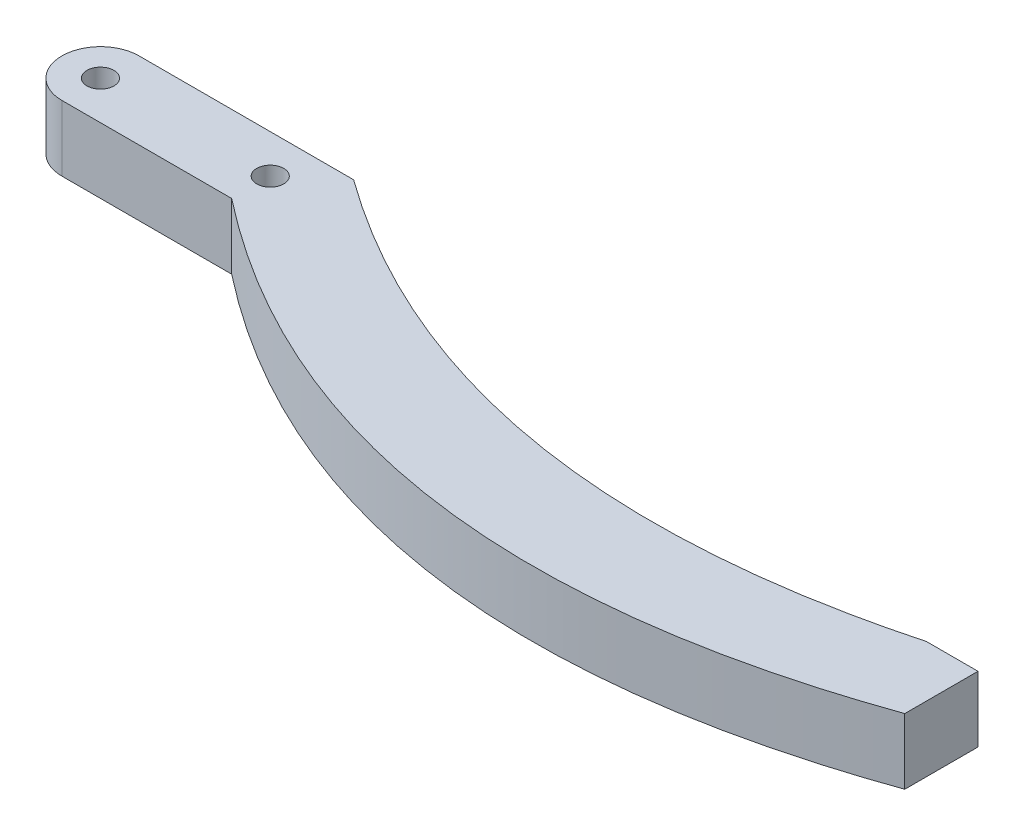
ISO-10303-21;
HEADER;
FILE_DESCRIPTION(('STEP AP214'),'2;1');
FILE_NAME('part.step','',(''),(''),'','','');
FILE_SCHEMA(('AUTOMOTIVE_DESIGN { 1 0 10303 214 1 1 1 1 }'));
ENDSEC;
DATA;
#1=APPLICATION_CONTEXT('core data for automotive mechanical design processes');
#2=APPLICATION_PROTOCOL_DEFINITION('international standard','automotive_design',2000,#1);
#3=PRODUCT_CONTEXT('',#1,'mechanical');
#4=PRODUCT('Part','Part','',(#3));
#5=PRODUCT_RELATED_PRODUCT_CATEGORY('part','',(#4));
#6=PRODUCT_DEFINITION_FORMATION('','',#4);
#7=PRODUCT_DEFINITION_CONTEXT('part definition',#1,'design');
#8=PRODUCT_DEFINITION('design','',#6,#7);
#9=PRODUCT_DEFINITION_SHAPE('','',#8);
#10=(LENGTH_UNIT() NAMED_UNIT(*) SI_UNIT(.MILLI.,.METRE.));
#11=(NAMED_UNIT(*) PLANE_ANGLE_UNIT() SI_UNIT($,.RADIAN.));
#12=(NAMED_UNIT(*) SI_UNIT($,.STERADIAN.) SOLID_ANGLE_UNIT());
#13=UNCERTAINTY_MEASURE_WITH_UNIT(LENGTH_MEASURE(1.E-05),#10,'distance_accuracy_value','');
#14=(GEOMETRIC_REPRESENTATION_CONTEXT(3) GLOBAL_UNCERTAINTY_ASSIGNED_CONTEXT((#13)) GLOBAL_UNIT_ASSIGNED_CONTEXT((#10,
#11,#12)) REPRESENTATION_CONTEXT('',''));
#15=CARTESIAN_POINT('',(0.,0.,0.));
#16=DIRECTION('',(0.,0.,1.));
#17=DIRECTION('',(1.,0.,0.));
#18=AXIS2_PLACEMENT_3D('',#15,#16,#17);
#19=CARTESIAN_POINT('',(0.,8.5,4.99999999999998));
#20=DIRECTION('',(0.,0.,1.));
#21=DIRECTION('',(1.,0.,0.));
#22=AXIS2_PLACEMENT_3D('',#19,#20,#21);
#23=PLANE('',#22);
#24=DIRECTION('',(-1.,0.,0.));
#25=VECTOR('',#24,1.);
#26=CARTESIAN_POINT('',(0.,0.,4.99999999999998));
#27=LINE('',#26,#25);
#28=CARTESIAN_POINT('',(0.,0.,4.99999999999998));
#29=VERTEX_POINT('',#28);
#30=CARTESIAN_POINT('',(-22.,0.,5.));
#31=VERTEX_POINT('',#30);
#32=EDGE_CURVE('E220',#29,#31,#27,.T.);
#33=ORIENTED_EDGE('',*,*,#32,.F.);
#34=DIRECTION('',(0.,-1.,0.));
#35=VECTOR('',#34,1.);
#36=CARTESIAN_POINT('',(0.,8.5,4.99999999999998));
#37=LINE('',#36,#35);
#38=CARTESIAN_POINT('',(0.,8.5,4.99999999999998));
#39=VERTEX_POINT('',#38);
#40=EDGE_CURVE('E11',#39,#29,#37,.T.);
#41=ORIENTED_EDGE('',*,*,#40,.F.);
#42=DIRECTION('',(-1.,0.,0.));
#43=VECTOR('',#42,1.);
#44=CARTESIAN_POINT('',(0.,8.5,4.99999999999998));
#45=LINE('',#44,#43);
#46=CARTESIAN_POINT('',(-22.,8.5,5.));
#47=VERTEX_POINT('',#46);
#48=EDGE_CURVE('E172',#39,#47,#45,.T.);
#49=ORIENTED_EDGE('',*,*,#48,.T.);
#50=DIRECTION('',(0.,-1.,0.));
#51=VECTOR('',#50,1.);
#52=CARTESIAN_POINT('',(-22.,8.5,5.));
#53=LINE('',#52,#51);
#54=EDGE_CURVE('E95',#47,#31,#53,.T.);
#55=ORIENTED_EDGE('',*,*,#54,.T.);
#56=EDGE_LOOP('',(#33,#41,#49,#55));
#57=FACE_BOUND('',#56,.T.);
#58=ADVANCED_FACE('F45',(#57),#23,.T.);
#59=CARTESIAN_POINT('',(0.,8.5,4.99999999999998));
#60=CARTESIAN_POINT('',(44.0607174625248,8.5,39.5752266662546));
#61=CARTESIAN_POINT('',(101.432631881709,8.5,19.199942722546));
#62=B_SPLINE_CURVE_WITH_KNOTS('',2,(#59,#60,#61),.UNSPECIFIED.,.F.,.F.,(3,3),(0.,1.),.UNSPECIFIED.);
#63=DIRECTION('',(0.,-1.,0.));
#64=VECTOR('',#63,1.);
#65=SURFACE_OF_LINEAR_EXTRUSION('',#62,#64);
#66=CARTESIAN_POINT('',(0.,0.,4.99999999999998));
#67=CARTESIAN_POINT('',(44.0607174625248,0.,39.5752266662546));
#68=CARTESIAN_POINT('',(101.432631881709,0.,19.199942722546));
#69=B_SPLINE_CURVE_WITH_KNOTS('',2,(#66,#67,#68),.UNSPECIFIED.,.F.,.F.,(3,3),(0.,1.),.UNSPECIFIED.);
#70=CARTESIAN_POINT('',(101.432631881709,0.,19.199942722546));
#71=VERTEX_POINT('',#70);
#72=EDGE_CURVE('E215',#29,#71,#69,.T.);
#73=ORIENTED_EDGE('',*,*,#72,.T.);
#74=DIRECTION('',(0.,-1.,0.));
#75=VECTOR('',#74,1.);
#76=CARTESIAN_POINT('',(101.432631881709,8.5,19.199942722546));
#77=LINE('',#76,#75);
#78=CARTESIAN_POINT('',(101.432631881709,8.5,19.199942722546));
#79=VERTEX_POINT('',#78);
#80=EDGE_CURVE('E55',#79,#71,#77,.T.);
#81=ORIENTED_EDGE('',*,*,#80,.F.);
#82=EDGE_CURVE('E166',#39,#79,#62,.T.);
#83=ORIENTED_EDGE('',*,*,#82,.F.);
#84=ORIENTED_EDGE('',*,*,#40,.T.);
#85=EDGE_LOOP('',(#73,#81,#83,#84));
#86=FACE_BOUND('',#85,.T.);
#87=ADVANCED_FACE('F160',(#86),#65,.F.);
#88=CARTESIAN_POINT('',(101.432631881709,8.5,0.));
#89=DIRECTION('',(1.,0.,0.));
#90=DIRECTION('',(0.,0.,-1.));
#91=AXIS2_PLACEMENT_3D('',#88,#89,#90);
#92=PLANE('',#91);
#93=DIRECTION('',(0.,0.,1.));
#94=VECTOR('',#93,1.);
#95=CARTESIAN_POINT('',(101.432631881709,0.,0.));
#96=LINE('',#95,#94);
#97=CARTESIAN_POINT('',(101.432631881709,0.,9.70672313107727));
#98=VERTEX_POINT('',#97);
#99=EDGE_CURVE('E211',#98,#71,#96,.T.);
#100=ORIENTED_EDGE('',*,*,#99,.F.);
#101=DIRECTION('',(0.,-1.,0.));
#102=VECTOR('',#101,1.);
#103=CARTESIAN_POINT('',(101.432631881709,8.5,9.70672313107727));
#104=LINE('',#103,#102);
#105=CARTESIAN_POINT('',(101.432631881709,8.5,9.70672313107727));
#106=VERTEX_POINT('',#105);
#107=EDGE_CURVE('E182',#106,#98,#104,.T.);
#108=ORIENTED_EDGE('',*,*,#107,.F.);
#109=DIRECTION('',(0.,0.,1.));
#110=VECTOR('',#109,1.);
#111=CARTESIAN_POINT('',(101.432631881709,8.5,0.));
#112=LINE('',#111,#110);
#113=EDGE_CURVE('E138',#106,#79,#112,.T.);
#114=ORIENTED_EDGE('',*,*,#113,.T.);
#115=ORIENTED_EDGE('',*,*,#80,.T.);
#116=EDGE_LOOP('',(#100,#108,#114,#115));
#117=FACE_BOUND('',#116,.T.);
#118=ADVANCED_FACE('F156',(#117),#92,.T.);
#119=CARTESIAN_POINT('',(0.,8.5,9.70672313107727));
#120=DIRECTION('',(0.,0.,-1.));
#121=DIRECTION('',(-1.,0.,0.));
#122=AXIS2_PLACEMENT_3D('',#119,#120,#121);
#123=PLANE('',#122);
#124=DIRECTION('',(1.,0.,0.));
#125=VECTOR('',#124,1.);
#126=CARTESIAN_POINT('',(0.,0.,9.70672313107727));
#127=LINE('',#126,#125);
#128=CARTESIAN_POINT('',(94.748347294238,0.,9.70672313107727));
#129=VERTEX_POINT('',#128);
#130=EDGE_CURVE('E185',#129,#98,#127,.T.);
#131=ORIENTED_EDGE('',*,*,#130,.F.);
#132=DIRECTION('',(0.,-1.,0.));
#133=VECTOR('',#132,1.);
#134=CARTESIAN_POINT('',(94.748347294238,8.5,9.70672313107727));
#135=LINE('',#134,#133);
#136=CARTESIAN_POINT('',(94.748347294238,8.5,9.70672313107727));
#137=VERTEX_POINT('',#136);
#138=EDGE_CURVE('E122',#137,#129,#135,.T.);
#139=ORIENTED_EDGE('',*,*,#138,.F.);
#140=DIRECTION('',(1.,0.,0.));
#141=VECTOR('',#140,1.);
#142=CARTESIAN_POINT('',(0.,8.5,9.70672313107727));
#143=LINE('',#142,#141);
#144=EDGE_CURVE('E134',#137,#106,#143,.T.);
#145=ORIENTED_EDGE('',*,*,#144,.T.);
#146=ORIENTED_EDGE('',*,*,#107,.T.);
#147=EDGE_LOOP('',(#131,#139,#145,#146));
#148=FACE_BOUND('',#147,.T.);
#149=ADVANCED_FACE('F152',(#148),#123,.T.);
#150=CARTESIAN_POINT('',(5.80901024848469,8.5,-5.00000000000002));
#151=CARTESIAN_POINT('',(44.7035915938563,8.5,23.1482274478453));
#152=CARTESIAN_POINT('',(94.748347294238,8.5,9.70672313107727));
#153=B_SPLINE_CURVE_WITH_KNOTS('',2,(#150,#151,#152),.UNSPECIFIED.,.F.,.F.,(3,3),(0.,1.),.UNSPECIFIED.);
#154=DIRECTION('',(0.,-1.,0.));
#155=VECTOR('',#154,1.);
#156=SURFACE_OF_LINEAR_EXTRUSION('',#153,#155);
#157=CARTESIAN_POINT('',(5.80901024848469,0.,-5.00000000000002));
#158=CARTESIAN_POINT('',(44.7035915938563,0.,23.1482274478453));
#159=CARTESIAN_POINT('',(94.748347294238,0.,9.70672313107727));
#160=B_SPLINE_CURVE_WITH_KNOTS('',2,(#157,#158,#159),.UNSPECIFIED.,.F.,.F.,(3,3),(0.,1.),.UNSPECIFIED.);
#161=CARTESIAN_POINT('',(5.80901024848469,0.,-5.00000000000002));
#162=VERTEX_POINT('',#161);
#163=EDGE_CURVE('E118',#162,#129,#160,.T.);
#164=ORIENTED_EDGE('',*,*,#163,.F.);
#165=DIRECTION('',(0.,-1.,0.));
#166=VECTOR('',#165,1.);
#167=CARTESIAN_POINT('',(5.80901024848469,8.5,-5.00000000000002));
#168=LINE('',#167,#166);
#169=CARTESIAN_POINT('',(5.80901024848469,8.5,-5.00000000000002));
#170=VERTEX_POINT('',#169);
#171=EDGE_CURVE('E112',#170,#162,#168,.T.);
#172=ORIENTED_EDGE('',*,*,#171,.F.);
#173=EDGE_CURVE('E116',#170,#137,#153,.T.);
#174=ORIENTED_EDGE('',*,*,#173,.T.);
#175=ORIENTED_EDGE('',*,*,#138,.T.);
#176=EDGE_LOOP('',(#164,#172,#174,#175));
#177=FACE_BOUND('',#176,.T.);
#178=ADVANCED_FACE('F114',(#177),#156,.T.);
#179=CARTESIAN_POINT('',(0.,8.5,-5.00000000000002));
#180=DIRECTION('',(0.,0.,1.));
#181=DIRECTION('',(1.,0.,0.));
#182=AXIS2_PLACEMENT_3D('',#179,#180,#181);
#183=PLANE('',#182);
#184=DIRECTION('',(-1.,0.,0.));
#185=VECTOR('',#184,1.);
#186=CARTESIAN_POINT('',(0.,0.,-5.00000000000002));
#187=LINE('',#186,#185);
#188=CARTESIAN_POINT('',(-22.,0.,-5.));
#189=VERTEX_POINT('',#188);
#190=EDGE_CURVE('E199',#162,#189,#187,.T.);
#191=ORIENTED_EDGE('',*,*,#190,.T.);
#192=DIRECTION('',(0.,-1.,0.));
#193=VECTOR('',#192,1.);
#194=CARTESIAN_POINT('',(-22.,8.5,-5.));
#195=LINE('',#194,#193);
#196=CARTESIAN_POINT('',(-22.,8.5,-5.));
#197=VERTEX_POINT('',#196);
#198=EDGE_CURVE('E123',#197,#189,#195,.T.);
#199=ORIENTED_EDGE('',*,*,#198,.F.);
#200=DIRECTION('',(-1.,0.,0.));
#201=VECTOR('',#200,1.);
#202=CARTESIAN_POINT('',(0.,8.5,-5.00000000000002));
#203=LINE('',#202,#201);
#204=EDGE_CURVE('E126',#170,#197,#203,.T.);
#205=ORIENTED_EDGE('',*,*,#204,.F.);
#206=ORIENTED_EDGE('',*,*,#171,.T.);
#207=EDGE_LOOP('',(#191,#199,#205,#206));
#208=FACE_BOUND('',#207,.T.);
#209=ADVANCED_FACE('F127',(#208),#183,.F.);
#210=CARTESIAN_POINT('',(0.,8.5,0.));
#211=DIRECTION('',(0.,-1.,0.));
#212=DIRECTION('',(0.,0.,-1.));
#213=AXIS2_PLACEMENT_3D('',#210,#211,#212);
#214=CYLINDRICAL_SURFACE('',#213,1.75);
#215=CARTESIAN_POINT('',(0.,8.5,0.));
#216=DIRECTION('',(0.,1.,0.));
#217=DIRECTION('',(0.,0.,1.));
#218=AXIS2_PLACEMENT_3D('',#215,#216,#217);
#219=CIRCLE('',#218,1.75);
#220=CARTESIAN_POINT('',(0.,8.5,1.75));
#221=VERTEX_POINT('',#220);
#222=EDGE_CURVE('E255',#221,#221,#219,.T.);
#223=ORIENTED_EDGE('',*,*,#222,.T.);
#224=EDGE_LOOP('',(#223));
#225=FACE_BOUND('',#224,.T.);
#226=CARTESIAN_POINT('',(0.,0.,0.));
#227=DIRECTION('',(0.,1.,0.));
#228=DIRECTION('',(0.,0.,1.));
#229=AXIS2_PLACEMENT_3D('',#226,#227,#228);
#230=CIRCLE('',#229,1.75);
#231=CARTESIAN_POINT('',(0.,0.,1.75));
#232=VERTEX_POINT('',#231);
#233=EDGE_CURVE('E226',#232,#232,#230,.T.);
#234=ORIENTED_EDGE('',*,*,#233,.F.);
#235=EDGE_LOOP('',(#234));
#236=FACE_BOUND('',#235,.T.);
#237=ADVANCED_FACE('F241',(#225,#236),#214,.F.);
#238=CARTESIAN_POINT('',(-22.,8.5,0.));
#239=DIRECTION('',(0.,-1.,0.));
#240=DIRECTION('',(0.,0.,-1.));
#241=AXIS2_PLACEMENT_3D('',#238,#239,#240);
#242=CYLINDRICAL_SURFACE('',#241,1.75);
#243=CARTESIAN_POINT('',(-22.,8.5,0.));
#244=DIRECTION('',(0.,1.,0.));
#245=DIRECTION('',(0.,0.,1.));
#246=AXIS2_PLACEMENT_3D('',#243,#244,#245);
#247=CIRCLE('',#246,1.75);
#248=CARTESIAN_POINT('',(-22.,8.5,1.75));
#249=VERTEX_POINT('',#248);
#250=EDGE_CURVE('E198',#249,#249,#247,.T.);
#251=ORIENTED_EDGE('',*,*,#250,.T.);
#252=EDGE_LOOP('',(#251));
#253=FACE_BOUND('',#252,.T.);
#254=CARTESIAN_POINT('',(-22.,0.,0.));
#255=DIRECTION('',(0.,1.,0.));
#256=DIRECTION('',(0.,0.,1.));
#257=AXIS2_PLACEMENT_3D('',#254,#255,#256);
#258=CIRCLE('',#257,1.75);
#259=CARTESIAN_POINT('',(-22.,0.,1.75));
#260=VERTEX_POINT('',#259);
#261=EDGE_CURVE('E230',#260,#260,#258,.T.);
#262=ORIENTED_EDGE('',*,*,#261,.F.);
#263=EDGE_LOOP('',(#262));
#264=FACE_BOUND('',#263,.T.);
#265=ADVANCED_FACE('F47',(#253,#264),#242,.F.);
#266=CARTESIAN_POINT('',(-22.,8.5,0.));
#267=DIRECTION('',(0.,-1.,0.));
#268=DIRECTION('',(0.,0.,-1.));
#269=AXIS2_PLACEMENT_3D('',#266,#267,#268);
#270=CYLINDRICAL_SURFACE('',#269,5.);
#271=CARTESIAN_POINT('',(-22.,0.,0.));
#272=DIRECTION('',(0.,1.,0.));
#273=DIRECTION('',(0.,0.,1.));
#274=AXIS2_PLACEMENT_3D('',#271,#272,#273);
#275=CIRCLE('',#274,5.);
#276=EDGE_CURVE('E88',#189,#31,#275,.T.);
#277=ORIENTED_EDGE('',*,*,#276,.T.);
#278=ORIENTED_EDGE('',*,*,#54,.F.);
#279=CARTESIAN_POINT('',(-22.,8.5,0.));
#280=DIRECTION('',(0.,1.,0.));
#281=DIRECTION('',(0.,0.,1.));
#282=AXIS2_PLACEMENT_3D('',#279,#280,#281);
#283=CIRCLE('',#282,5.);
#284=EDGE_CURVE('E63',#197,#47,#283,.T.);
#285=ORIENTED_EDGE('',*,*,#284,.F.);
#286=ORIENTED_EDGE('',*,*,#198,.T.);
#287=EDGE_LOOP('',(#277,#278,#285,#286));
#288=FACE_BOUND('',#287,.T.);
#289=ADVANCED_FACE('F240',(#288),#270,.T.);
#290=CARTESIAN_POINT('',(0.,8.5,0.));
#291=DIRECTION('',(0.,1.,0.));
#292=DIRECTION('',(0.,0.,1.));
#293=AXIS2_PLACEMENT_3D('',#290,#291,#292);
#294=PLANE('',#293);
#295=ORIENTED_EDGE('',*,*,#250,.F.);
#296=EDGE_LOOP('',(#295));
#297=FACE_BOUND('',#296,.T.);
#298=ORIENTED_EDGE('',*,*,#222,.F.);
#299=EDGE_LOOP('',(#298));
#300=FACE_BOUND('',#299,.T.);
#301=ORIENTED_EDGE('',*,*,#48,.F.);
#302=ORIENTED_EDGE('',*,*,#82,.T.);
#303=ORIENTED_EDGE('',*,*,#113,.F.);
#304=ORIENTED_EDGE('',*,*,#144,.F.);
#305=ORIENTED_EDGE('',*,*,#173,.F.);
#306=ORIENTED_EDGE('',*,*,#204,.T.);
#307=ORIENTED_EDGE('',*,*,#284,.T.);
#308=EDGE_LOOP('',(#301,#302,#303,#304,#305,#306,#307));
#309=FACE_BOUND('',#308,.T.);
#310=ADVANCED_FACE('F131',(#297,#300,#309),#294,.T.);
#311=CARTESIAN_POINT('',(0.,0.,0.));
#312=DIRECTION('',(0.,1.,0.));
#313=DIRECTION('',(0.,0.,1.));
#314=AXIS2_PLACEMENT_3D('',#311,#312,#313);
#315=PLANE('',#314);
#316=ORIENTED_EDGE('',*,*,#261,.T.);
#317=EDGE_LOOP('',(#316));
#318=FACE_BOUND('',#317,.T.);
#319=ORIENTED_EDGE('',*,*,#233,.T.);
#320=EDGE_LOOP('',(#319));
#321=FACE_BOUND('',#320,.T.);
#322=ORIENTED_EDGE('',*,*,#32,.T.);
#323=ORIENTED_EDGE('',*,*,#276,.F.);
#324=ORIENTED_EDGE('',*,*,#190,.F.);
#325=ORIENTED_EDGE('',*,*,#163,.T.);
#326=ORIENTED_EDGE('',*,*,#130,.T.);
#327=ORIENTED_EDGE('',*,*,#99,.T.);
#328=ORIENTED_EDGE('',*,*,#72,.F.);
#329=EDGE_LOOP('',(#322,#323,#324,#325,#326,#327,#328));
#330=FACE_BOUND('',#329,.T.);
#331=ADVANCED_FACE('F236',(#318,#321,#330),#315,.F.);
#332=CLOSED_SHELL('',(#58,#87,#118,#149,#178,#209,#237,#265,#289,#310,#331));
#333=MANIFOLD_SOLID_BREP('B2',#332);
#334=ADVANCED_BREP_SHAPE_REPRESENTATION('',(#18,#333),#14);
#335=SHAPE_DEFINITION_REPRESENTATION(#9,#334);
ENDSEC;
END-ISO-10303-21;
